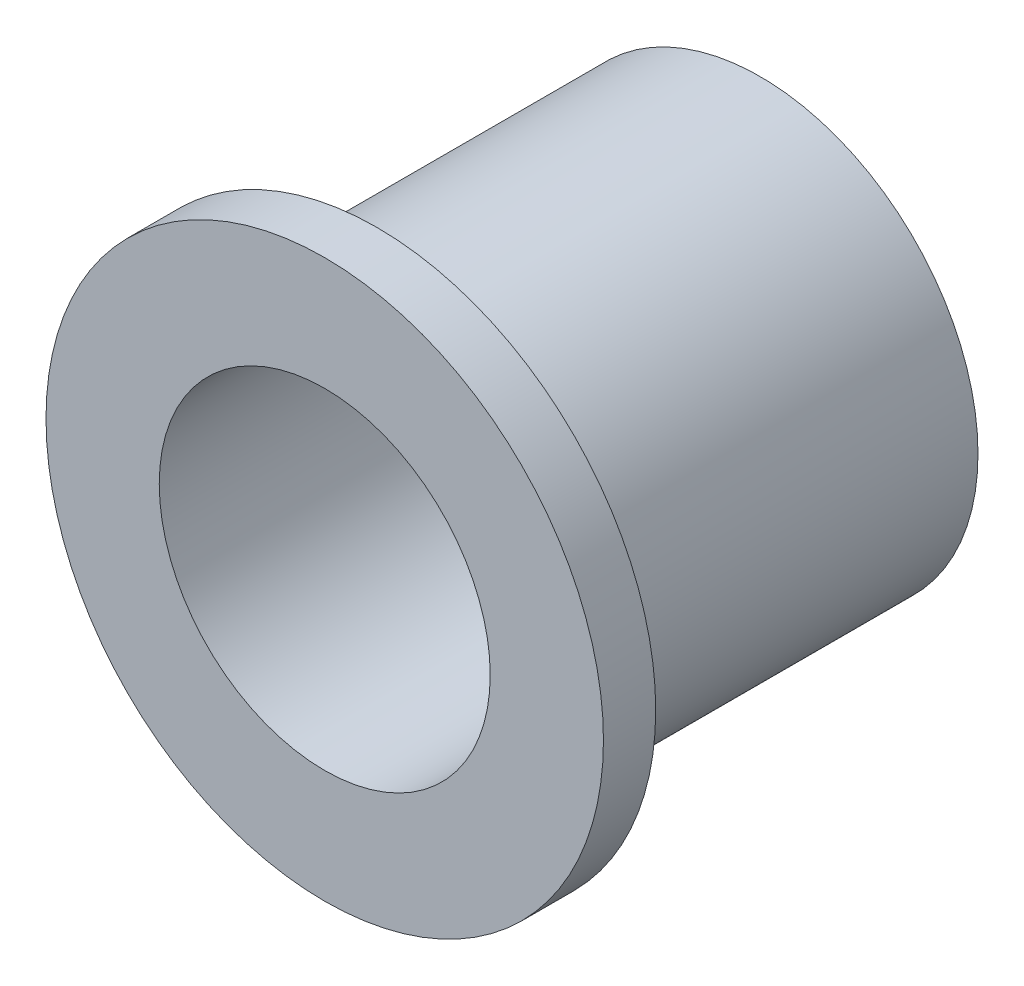
ISO-10303-21;
HEADER;
FILE_DESCRIPTION(('STEP AP214'),'2;1');
FILE_NAME('part.step','',(''),(''),'','','');
FILE_SCHEMA(('AUTOMOTIVE_DESIGN { 1 0 10303 214 1 1 1 1 }'));
ENDSEC;
DATA;
#1=APPLICATION_CONTEXT('core data for automotive mechanical design processes');
#2=APPLICATION_PROTOCOL_DEFINITION('international standard','automotive_design',2000,#1);
#3=PRODUCT_CONTEXT('',#1,'mechanical');
#4=PRODUCT('Part','Part','',(#3));
#5=PRODUCT_RELATED_PRODUCT_CATEGORY('part','',(#4));
#6=PRODUCT_DEFINITION_FORMATION('','',#4);
#7=PRODUCT_DEFINITION_CONTEXT('part definition',#1,'design');
#8=PRODUCT_DEFINITION('design','',#6,#7);
#9=PRODUCT_DEFINITION_SHAPE('','',#8);
#10=(LENGTH_UNIT() NAMED_UNIT(*) SI_UNIT(.MILLI.,.METRE.));
#11=(NAMED_UNIT(*) PLANE_ANGLE_UNIT() SI_UNIT($,.RADIAN.));
#12=(NAMED_UNIT(*) SI_UNIT($,.STERADIAN.) SOLID_ANGLE_UNIT());
#13=UNCERTAINTY_MEASURE_WITH_UNIT(LENGTH_MEASURE(1.E-05),#10,'distance_accuracy_value','');
#14=(GEOMETRIC_REPRESENTATION_CONTEXT(3) GLOBAL_UNCERTAINTY_ASSIGNED_CONTEXT((#13)) GLOBAL_UNIT_ASSIGNED_CONTEXT((#10,
#11,#12)) REPRESENTATION_CONTEXT('',''));
#15=CARTESIAN_POINT('',(0.,0.,0.));
#16=DIRECTION('',(0.,0.,1.));
#17=DIRECTION('',(1.,0.,0.));
#18=AXIS2_PLACEMENT_3D('',#15,#16,#17);
#19=CARTESIAN_POINT('',(0.,0.,22.));
#20=DIRECTION('',(0.,0.,-1.));
#21=DIRECTION('',(-1.,0.,0.));
#22=AXIS2_PLACEMENT_3D('',#19,#20,#21);
#23=CYLINDRICAL_SURFACE('',#22,12.5);
#24=CARTESIAN_POINT('',(0.,0.,22.));
#25=DIRECTION('',(0.,0.,1.));
#26=DIRECTION('',(1.,0.,0.));
#27=AXIS2_PLACEMENT_3D('',#24,#25,#26);
#28=CIRCLE('',#27,12.5);
#29=CARTESIAN_POINT('',(12.5,0.,22.));
#30=VERTEX_POINT('',#29);
#31=EDGE_CURVE('E10',#30,#30,#28,.T.);
#32=ORIENTED_EDGE('',*,*,#31,.F.);
#33=EDGE_LOOP('',(#32));
#34=FACE_BOUND('',#33,.T.);
#35=CARTESIAN_POINT('',(0.,0.,0.));
#36=DIRECTION('',(0.,0.,1.));
#37=DIRECTION('',(1.,0.,0.));
#38=AXIS2_PLACEMENT_3D('',#35,#36,#37);
#39=CIRCLE('',#38,12.5);
#40=CARTESIAN_POINT('',(12.5,0.,0.));
#41=VERTEX_POINT('',#40);
#42=EDGE_CURVE('E40',#41,#41,#39,.T.);
#43=ORIENTED_EDGE('',*,*,#42,.T.);
#44=EDGE_LOOP('',(#43));
#45=FACE_BOUND('',#44,.T.);
#46=ADVANCED_FACE('F37',(#34,#45),#23,.T.);
#47=CARTESIAN_POINT('',(0.,0.,0.));
#48=DIRECTION('',(0.,0.,1.));
#49=DIRECTION('',(1.,0.,0.));
#50=AXIS2_PLACEMENT_3D('',#47,#48,#49);
#51=PLANE('',#50);
#52=CARTESIAN_POINT('',(0.,0.,0.));
#53=DIRECTION('',(0.,0.,1.));
#54=DIRECTION('',(1.,0.,0.));
#55=AXIS2_PLACEMENT_3D('',#52,#53,#54);
#56=CIRCLE('',#55,9.5);
#57=CARTESIAN_POINT('',(9.5,0.,0.));
#58=VERTEX_POINT('',#57);
#59=EDGE_CURVE('E55',#58,#58,#56,.T.);
#60=ORIENTED_EDGE('',*,*,#59,.T.);
#61=EDGE_LOOP('',(#60));
#62=FACE_BOUND('',#61,.T.);
#63=ORIENTED_EDGE('',*,*,#42,.F.);
#64=EDGE_LOOP('',(#63));
#65=FACE_BOUND('',#64,.T.);
#66=ADVANCED_FACE('F67',(#62,#65),#51,.F.);
#67=CARTESIAN_POINT('',(0.,0.,25.));
#68=DIRECTION('',(0.,0.,-1.));
#69=DIRECTION('',(-1.,0.,0.));
#70=AXIS2_PLACEMENT_3D('',#67,#68,#69);
#71=CYLINDRICAL_SURFACE('',#70,16.);
#72=CARTESIAN_POINT('',(0.,0.,25.));
#73=DIRECTION('',(0.,0.,1.));
#74=DIRECTION('',(1.,0.,0.));
#75=AXIS2_PLACEMENT_3D('',#72,#73,#74);
#76=CIRCLE('',#75,16.);
#77=CARTESIAN_POINT('',(16.,0.,25.));
#78=VERTEX_POINT('',#77);
#79=EDGE_CURVE('E49',#78,#78,#76,.T.);
#80=ORIENTED_EDGE('',*,*,#79,.F.);
#81=EDGE_LOOP('',(#80));
#82=FACE_BOUND('',#81,.T.);
#83=CARTESIAN_POINT('',(0.,0.,22.));
#84=DIRECTION('',(0.,0.,1.));
#85=DIRECTION('',(1.,0.,0.));
#86=AXIS2_PLACEMENT_3D('',#83,#84,#85);
#87=CIRCLE('',#86,16.);
#88=CARTESIAN_POINT('',(16.,0.,22.));
#89=VERTEX_POINT('',#88);
#90=EDGE_CURVE('E51',#89,#89,#87,.T.);
#91=ORIENTED_EDGE('',*,*,#90,.T.);
#92=EDGE_LOOP('',(#91));
#93=FACE_BOUND('',#92,.T.);
#94=ADVANCED_FACE('F80',(#82,#93),#71,.T.);
#95=CARTESIAN_POINT('',(0.,0.,25.));
#96=DIRECTION('',(0.,0.,1.));
#97=DIRECTION('',(1.,0.,0.));
#98=AXIS2_PLACEMENT_3D('',#95,#96,#97);
#99=PLANE('',#98);
#100=CARTESIAN_POINT('',(0.,0.,25.));
#101=DIRECTION('',(0.,0.,1.));
#102=DIRECTION('',(1.,0.,0.));
#103=AXIS2_PLACEMENT_3D('',#100,#101,#102);
#104=CIRCLE('',#103,9.5);
#105=CARTESIAN_POINT('',(9.5,0.,25.));
#106=VERTEX_POINT('',#105);
#107=EDGE_CURVE('E59',#106,#106,#104,.T.);
#108=ORIENTED_EDGE('',*,*,#107,.F.);
#109=EDGE_LOOP('',(#108));
#110=FACE_BOUND('',#109,.T.);
#111=ORIENTED_EDGE('',*,*,#79,.T.);
#112=EDGE_LOOP('',(#111));
#113=FACE_BOUND('',#112,.T.);
#114=ADVANCED_FACE('F77',(#110,#113),#99,.T.);
#115=CARTESIAN_POINT('',(0.,0.,22.));
#116=DIRECTION('',(0.,0.,1.));
#117=DIRECTION('',(1.,0.,0.));
#118=AXIS2_PLACEMENT_3D('',#115,#116,#117);
#119=PLANE('',#118);
#120=ORIENTED_EDGE('',*,*,#31,.T.);
#121=EDGE_LOOP('',(#120));
#122=FACE_BOUND('',#121,.T.);
#123=ORIENTED_EDGE('',*,*,#90,.F.);
#124=EDGE_LOOP('',(#123));
#125=FACE_BOUND('',#124,.T.);
#126=ADVANCED_FACE('F73',(#122,#125),#119,.F.);
#127=CARTESIAN_POINT('',(0.,0.,0.));
#128=DIRECTION('',(0.,0.,1.));
#129=DIRECTION('',(1.,0.,0.));
#130=AXIS2_PLACEMENT_3D('',#127,#128,#129);
#131=CYLINDRICAL_SURFACE('',#130,9.5);
#132=CARTESIAN_POINT('',(9.5,0.,0.));
#133=CARTESIAN_POINT('',(9.5,0.,0.260416666666666));
#134=CARTESIAN_POINT('',(9.5,0.,0.520833333333333));
#135=CARTESIAN_POINT('',(9.5,0.,1.04166666666667));
#136=CARTESIAN_POINT('',(9.5,0.,1.30208333333333));
#137=CARTESIAN_POINT('',(9.5,0.,1.82291666666667));
#138=CARTESIAN_POINT('',(9.5,0.,2.08333333333333));
#139=CARTESIAN_POINT('',(9.5,0.,2.60416666666667));
#140=CARTESIAN_POINT('',(9.5,0.,2.86458333333333));
#141=CARTESIAN_POINT('',(9.5,0.,3.38541666666667));
#142=CARTESIAN_POINT('',(9.5,0.,3.64583333333333));
#143=CARTESIAN_POINT('',(9.5,0.,4.16666666666667));
#144=CARTESIAN_POINT('',(9.5,0.,4.42708333333333));
#145=CARTESIAN_POINT('',(9.5,0.,4.94791666666667));
#146=CARTESIAN_POINT('',(9.5,0.,5.20833333333333));
#147=CARTESIAN_POINT('',(9.5,0.,5.72916666666667));
#148=CARTESIAN_POINT('',(9.5,0.,5.98958333333333));
#149=CARTESIAN_POINT('',(9.5,0.,6.51041666666667));
#150=CARTESIAN_POINT('',(9.5,0.,6.77083333333333));
#151=CARTESIAN_POINT('',(9.5,0.,7.29166666666667));
#152=CARTESIAN_POINT('',(9.5,0.,7.55208333333333));
#153=CARTESIAN_POINT('',(9.5,0.,8.07291666666667));
#154=CARTESIAN_POINT('',(9.5,0.,8.33333333333333));
#155=CARTESIAN_POINT('',(9.5,0.,8.85416666666667));
#156=CARTESIAN_POINT('',(9.5,0.,9.11458333333333));
#157=CARTESIAN_POINT('',(9.5,0.,9.63541666666667));
#158=CARTESIAN_POINT('',(9.5,0.,9.89583333333333));
#159=CARTESIAN_POINT('',(9.5,0.,10.4166666666667));
#160=CARTESIAN_POINT('',(9.5,0.,10.6770833333333));
#161=CARTESIAN_POINT('',(9.5,0.,11.1979166666667));
#162=CARTESIAN_POINT('',(9.5,0.,11.4583333333333));
#163=CARTESIAN_POINT('',(9.5,0.,11.9791666666667));
#164=CARTESIAN_POINT('',(9.5,0.,12.2395833333333));
#165=CARTESIAN_POINT('',(9.5,0.,12.7604166666667));
#166=CARTESIAN_POINT('',(9.5,0.,13.0208333333333));
#167=CARTESIAN_POINT('',(9.5,0.,13.5416666666667));
#168=CARTESIAN_POINT('',(9.5,0.,13.8020833333333));
#169=CARTESIAN_POINT('',(9.5,0.,14.3229166666667));
#170=CARTESIAN_POINT('',(9.5,0.,14.5833333333333));
#171=CARTESIAN_POINT('',(9.5,0.,15.1041666666667));
#172=CARTESIAN_POINT('',(9.5,0.,15.3645833333333));
#173=CARTESIAN_POINT('',(9.5,0.,15.8854166666667));
#174=CARTESIAN_POINT('',(9.5,0.,16.1458333333333));
#175=CARTESIAN_POINT('',(9.5,0.,16.6666666666667));
#176=CARTESIAN_POINT('',(9.5,0.,16.9270833333333));
#177=CARTESIAN_POINT('',(9.5,0.,17.4479166666667));
#178=CARTESIAN_POINT('',(9.5,0.,17.7083333333333));
#179=CARTESIAN_POINT('',(9.5,0.,18.2291666666667));
#180=CARTESIAN_POINT('',(9.5,0.,18.4895833333333));
#181=CARTESIAN_POINT('',(9.5,0.,19.0104166666667));
#182=CARTESIAN_POINT('',(9.5,0.,19.2708333333333));
#183=CARTESIAN_POINT('',(9.5,0.,19.7916666666667));
#184=CARTESIAN_POINT('',(9.5,0.,20.0520833333333));
#185=CARTESIAN_POINT('',(9.5,0.,20.5729166666667));
#186=CARTESIAN_POINT('',(9.5,0.,20.8333333333333));
#187=CARTESIAN_POINT('',(9.5,0.,21.3541666666667));
#188=CARTESIAN_POINT('',(9.5,0.,21.6145833333333));
#189=CARTESIAN_POINT('',(9.5,0.,22.1354166666667));
#190=CARTESIAN_POINT('',(9.5,0.,22.3958333333333));
#191=CARTESIAN_POINT('',(9.5,0.,22.9166666666667));
#192=CARTESIAN_POINT('',(9.5,0.,23.1770833333333));
#193=CARTESIAN_POINT('',(9.5,0.,23.6979166666667));
#194=CARTESIAN_POINT('',(9.5,0.,23.9583333333333));
#195=CARTESIAN_POINT('',(9.5,0.,24.4791666666667));
#196=CARTESIAN_POINT('',(9.5,0.,24.7395833333333));
#197=CARTESIAN_POINT('',(9.5,0.,25.));
#198=B_SPLINE_CURVE_WITH_KNOTS('',3,(#132,#133,#134,#135,#136,#137,#138,#139,#140,#141,#142,
#143,#144,#145,#146,#147,#148,#149,#150,#151,#152,#153,#154,#155,#156,#157,#158,#159,#160,#161,
#162,#163,#164,#165,#166,#167,#168,#169,#170,#171,#172,#173,#174,#175,#176,#177,#178,#179,#180,
#181,#182,#183,#184,#185,#186,#187,#188,#189,#190,#191,#192,#193,#194,#195,#196,#197),
.UNSPECIFIED.,.F.,.F.,(4,2,2,2,2,2,2,2,2,2,2,2,2,2,2,2,2,2,2,2,2,2,2,2,2,2,2,2,2,2,2,2,4),(0.,
0.78125,1.5625,2.34375,3.125,3.90625,4.6875,5.46875,6.25,7.03125,7.8125,8.59375,9.375,10.15625,
10.9375,11.71875,12.5,13.28125,14.0625,14.84375,15.625,16.40625,17.1875,17.96875,18.75,19.53125,
20.3125,21.09375,21.875,22.65625,23.4375,24.21875,25.),.UNSPECIFIED.);
#199=EDGE_CURVE('BSEAM70',#58,#106,#198,.T.);
#200=ORIENTED_EDGE('',*,*,#59,.F.);
#201=ORIENTED_EDGE('',*,*,#107,.T.);
#202=ORIENTED_EDGE('',*,*,#199,.T.);
#203=ORIENTED_EDGE('',*,*,#199,.F.);
#204=EDGE_LOOP('',(#200,#202,#201,#203));
#205=FACE_BOUND('',#204,.T.);
#206=ADVANCED_FACE('F70',(#205),#131,.F.);
#207=CLOSED_SHELL('',(#46,#66,#94,#114,#126,#206));
#208=MANIFOLD_SOLID_BREP('B2',#207);
#209=ADVANCED_BREP_SHAPE_REPRESENTATION('',(#18,#208),#14);
#210=SHAPE_DEFINITION_REPRESENTATION(#9,#209);
ENDSEC;
END-ISO-10303-21;
